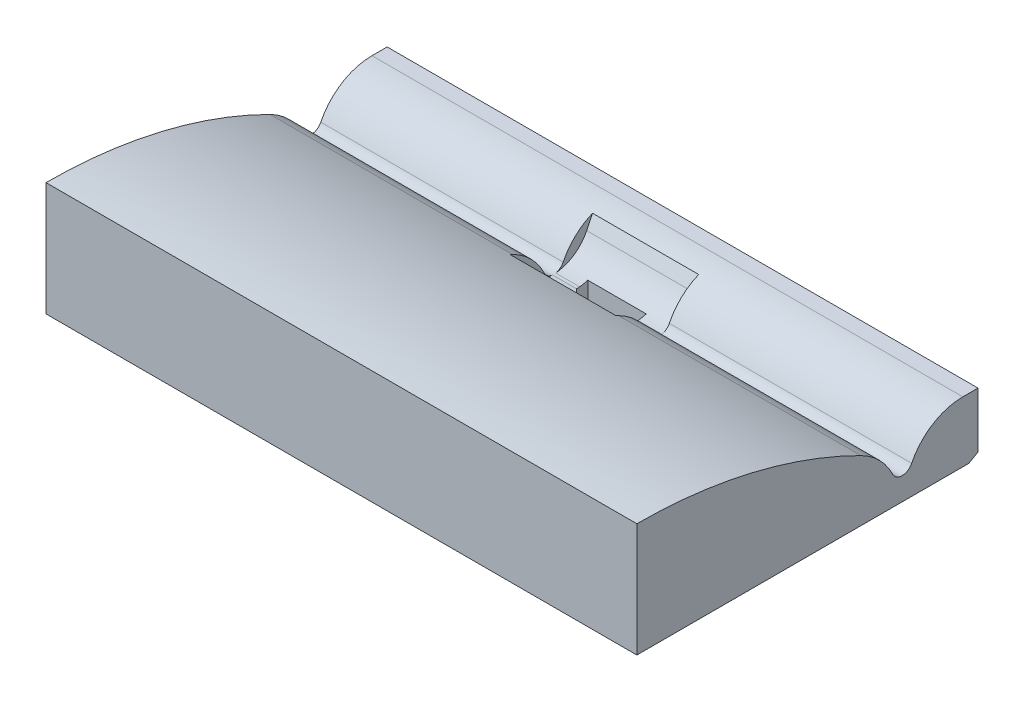
ISO-10303-21;
HEADER;
FILE_DESCRIPTION(('STEP AP214'),'2;1');
FILE_NAME('part.step','',(''),(''),'','','');
FILE_SCHEMA(('AUTOMOTIVE_DESIGN { 1 0 10303 214 1 1 1 1 }'));
ENDSEC;
DATA;
#1=APPLICATION_CONTEXT('core data for automotive mechanical design processes');
#2=APPLICATION_PROTOCOL_DEFINITION('international standard','automotive_design',2000,#1);
#3=PRODUCT_CONTEXT('',#1,'mechanical');
#4=PRODUCT('Part','Part','',(#3));
#5=PRODUCT_RELATED_PRODUCT_CATEGORY('part','',(#4));
#6=PRODUCT_DEFINITION_FORMATION('','',#4);
#7=PRODUCT_DEFINITION_CONTEXT('part definition',#1,'design');
#8=PRODUCT_DEFINITION('design','',#6,#7);
#9=PRODUCT_DEFINITION_SHAPE('','',#8);
#10=(LENGTH_UNIT() NAMED_UNIT(*) SI_UNIT(.MILLI.,.METRE.));
#11=(NAMED_UNIT(*) PLANE_ANGLE_UNIT() SI_UNIT($,.RADIAN.));
#12=(NAMED_UNIT(*) SI_UNIT($,.STERADIAN.) SOLID_ANGLE_UNIT());
#13=UNCERTAINTY_MEASURE_WITH_UNIT(LENGTH_MEASURE(1.E-05),#10,'distance_accuracy_value','');
#14=(GEOMETRIC_REPRESENTATION_CONTEXT(3) GLOBAL_UNCERTAINTY_ASSIGNED_CONTEXT((#13)) GLOBAL_UNIT_ASSIGNED_CONTEXT((#10,
#11,#12)) REPRESENTATION_CONTEXT('',''));
#15=CARTESIAN_POINT('',(0.,0.,0.));
#16=DIRECTION('',(0.,0.,1.));
#17=DIRECTION('',(1.,0.,0.));
#18=AXIS2_PLACEMENT_3D('',#15,#16,#17);
#19=CARTESIAN_POINT('',(38.9711431702997,52.2246829705794,19.5711631372731));
#20=DIRECTION('',(-1.,0.,0.));
#21=DIRECTION('',(0.,0.,1.));
#22=AXIS2_PLACEMENT_3D('',#19,#20,#21);
#23=CYLINDRICAL_SURFACE('',#22,9.25729399021629);
#24=CARTESIAN_POINT('',(7.,52.2246829705794,19.5711631372731));
#25=DIRECTION('',(-1.,0.,0.));
#26=DIRECTION('',(0.,0.,1.));
#27=AXIS2_PLACEMENT_3D('',#24,#25,#26);
#28=CIRCLE('',#27,9.25729399021629);
#29=CARTESIAN_POINT('',(7.,60.5,15.4218716213784));
#30=VERTEX_POINT('',#29);
#31=CARTESIAN_POINT('',(7.,56.28125,11.25));
#32=VERTEX_POINT('',#31);
#33=EDGE_CURVE('E261',#30,#32,#28,.T.);
#34=ORIENTED_EDGE('',*,*,#33,.F.);
#35=DIRECTION('',(-1.,0.,0.));
#36=VECTOR('',#35,1.);
#37=CARTESIAN_POINT('',(38.9711431702997,60.5,15.4218716213784));
#38=LINE('',#37,#36);
#39=CARTESIAN_POINT('',(38.9711431702997,60.5,15.4218716213784));
#40=VERTEX_POINT('',#39);
#41=EDGE_CURVE('E372',#40,#30,#38,.T.);
#42=ORIENTED_EDGE('',*,*,#41,.F.);
#43=CARTESIAN_POINT('',(38.9711431702997,52.2246829705794,19.5711631372731));
#44=DIRECTION('',(1.,0.,0.));
#45=DIRECTION('',(0.,0.,1.));
#46=AXIS2_PLACEMENT_3D('',#43,#44,#45);
#47=CIRCLE('',#46,9.25729399021629);
#48=CARTESIAN_POINT('',(38.9711431702997,56.28125,11.25));
#49=VERTEX_POINT('',#48);
#50=EDGE_CURVE('E353',#49,#40,#47,.T.);
#51=ORIENTED_EDGE('',*,*,#50,.F.);
#52=DIRECTION('',(-1.,0.,0.));
#53=VECTOR('',#52,1.);
#54=CARTESIAN_POINT('',(38.9711431702997,56.28125,11.25));
#55=LINE('',#54,#53);
#56=EDGE_CURVE('E376',#49,#32,#55,.T.);
#57=ORIENTED_EDGE('',*,*,#56,.T.);
#58=EDGE_LOOP('',(#34,#42,#51,#57));
#59=FACE_BOUND('',#58,.T.);
#60=ADVANCED_FACE('F37',(#59),#23,.T.);
#61=CARTESIAN_POINT('',(38.9711431702997,56.890625,10.));
#62=DIRECTION('',(-1.,0.,0.));
#63=DIRECTION('',(0.,0.,1.));
#64=AXIS2_PLACEMENT_3D('',#61,#62,#63);
#65=CYLINDRICAL_SURFACE('',#64,1.390625);
#66=CARTESIAN_POINT('',(7.,56.890625,10.));
#67=DIRECTION('',(-1.,0.,0.));
#68=DIRECTION('',(0.,0.,1.));
#69=AXIS2_PLACEMENT_3D('',#66,#67,#68);
#70=CIRCLE('',#69,1.390625);
#71=CARTESIAN_POINT('',(7.,55.5252776994791,9.73605940140772));
#72=VERTEX_POINT('',#71);
#73=CARTESIAN_POINT('',(7.,56.28125,8.75));
#74=VERTEX_POINT('',#73);
#75=EDGE_CURVE('E266',#72,#74,#70,.F.);
#76=ORIENTED_EDGE('',*,*,#75,.F.);
#77=DIRECTION('',(1.,0.,0.));
#78=VECTOR('',#77,1.);
#79=CARTESIAN_POINT('',(0.,55.5252776994791,9.73605940140772));
#80=LINE('',#79,#78);
#81=CARTESIAN_POINT('',(3.85,55.5252776994791,9.73605940140772));
#82=VERTEX_POINT('',#81);
#83=EDGE_CURVE('E246',#72,#82,#80,.F.);
#84=ORIENTED_EDGE('',*,*,#83,.T.);
#85=CARTESIAN_POINT('',(3.85,56.890625,10.));
#86=DIRECTION('',(1.,0.,0.));
#87=DIRECTION('',(0.,0.,-1.));
#88=AXIS2_PLACEMENT_3D('',#85,#86,#87);
#89=CIRCLE('',#88,1.390625);
#90=CARTESIAN_POINT('',(3.85,55.5081135567833,10.15));
#91=VERTEX_POINT('',#90);
#92=EDGE_CURVE('E290',#91,#82,#89,.T.);
#93=ORIENTED_EDGE('',*,*,#92,.F.);
#94=DIRECTION('',(1.,0.,0.));
#95=VECTOR('',#94,1.);
#96=CARTESIAN_POINT('',(0.,55.5081135567833,10.15));
#97=LINE('',#96,#95);
#98=CARTESIAN_POINT('',(7.,55.5081135567833,10.15));
#99=VERTEX_POINT('',#98);
#100=EDGE_CURVE('E258',#91,#99,#97,.T.);
#101=ORIENTED_EDGE('',*,*,#100,.T.);
#102=EDGE_CURVE('E263',#32,#99,#70,.F.);
#103=ORIENTED_EDGE('',*,*,#102,.F.);
#104=ORIENTED_EDGE('',*,*,#56,.F.);
#105=CARTESIAN_POINT('',(38.9711431702997,56.890625,10.));
#106=DIRECTION('',(-1.,0.,0.));
#107=DIRECTION('',(0.,0.,-1.));
#108=AXIS2_PLACEMENT_3D('',#105,#106,#107);
#109=CIRCLE('',#108,1.390625);
#110=CARTESIAN_POINT('',(38.9711431702997,56.28125,8.75));
#111=VERTEX_POINT('',#110);
#112=EDGE_CURVE('E351',#111,#49,#109,.T.);
#113=ORIENTED_EDGE('',*,*,#112,.F.);
#114=DIRECTION('',(-1.,0.,0.));
#115=VECTOR('',#114,1.);
#116=CARTESIAN_POINT('',(38.9711431702997,56.28125,8.75));
#117=LINE('',#116,#115);
#118=EDGE_CURVE('E380',#111,#74,#117,.T.);
#119=ORIENTED_EDGE('',*,*,#118,.T.);
#120=EDGE_LOOP('',(#76,#84,#93,#101,#103,#104,#113,#119));
#121=FACE_BOUND('',#120,.T.);
#122=ADVANCED_FACE('F456',(#121),#65,.F.);
#123=CARTESIAN_POINT('',(38.9711431702997,53.2,0.));
#124=DIRECTION('',(0.,0.,1.));
#125=DIRECTION('',(1.,0.,0.));
#126=AXIS2_PLACEMENT_3D('',#123,#124,#125);
#127=PLANE('',#126);
#128=DIRECTION('',(-1.,0.,0.));
#129=VECTOR('',#128,1.);
#130=CARTESIAN_POINT('',(38.9711431702997,53.2,0.));
#131=LINE('',#130,#129);
#132=CARTESIAN_POINT('',(38.9711431702997,53.2,0.));
#133=VERTEX_POINT('',#132);
#134=CARTESIAN_POINT('',(-38.9711431702997,53.2,0.));
#135=VERTEX_POINT('',#134);
#136=EDGE_CURVE('E363',#133,#135,#131,.T.);
#137=ORIENTED_EDGE('',*,*,#136,.T.);
#138=DIRECTION('',(0.,1.,0.));
#139=VECTOR('',#138,1.);
#140=CARTESIAN_POINT('',(-38.9711431702997,53.2,0.));
#141=LINE('',#140,#139);
#142=CARTESIAN_POINT('',(-38.9711431702997,60.5,0.));
#143=VERTEX_POINT('',#142);
#144=EDGE_CURVE('E317',#135,#143,#141,.T.);
#145=ORIENTED_EDGE('',*,*,#144,.T.);
#146=DIRECTION('',(-1.,0.,0.));
#147=VECTOR('',#146,1.);
#148=CARTESIAN_POINT('',(38.9711431702997,60.5,0.));
#149=LINE('',#148,#147);
#150=CARTESIAN_POINT('',(38.9711431702997,60.5,0.));
#151=VERTEX_POINT('',#150);
#152=EDGE_CURVE('E385',#151,#143,#149,.T.);
#153=ORIENTED_EDGE('',*,*,#152,.F.);
#154=DIRECTION('',(0.,1.,0.));
#155=VECTOR('',#154,1.);
#156=CARTESIAN_POINT('',(38.9711431702997,53.2,0.));
#157=LINE('',#156,#155);
#158=EDGE_CURVE('E344',#133,#151,#157,.T.);
#159=ORIENTED_EDGE('',*,*,#158,.F.);
#160=EDGE_LOOP('',(#137,#145,#153,#159));
#161=FACE_BOUND('',#160,.T.);
#162=ADVANCED_FACE('F39',(#161),#127,.F.);
#163=CARTESIAN_POINT('',(38.9711431702997,60.5,0.));
#164=DIRECTION('',(0.,-1.,0.));
#165=DIRECTION('',(0.,0.,-1.));
#166=AXIS2_PLACEMENT_3D('',#163,#164,#165);
#167=PLANE('',#166);
#168=ORIENTED_EDGE('',*,*,#152,.T.);
#169=DIRECTION('',(0.,0.,1.));
#170=VECTOR('',#169,1.);
#171=CARTESIAN_POINT('',(-38.9711431702997,60.5,0.));
#172=LINE('',#171,#170);
#173=CARTESIAN_POINT('',(-38.9711431702997,60.5,2.));
#174=VERTEX_POINT('',#173);
#175=EDGE_CURVE('E320',#143,#174,#172,.T.);
#176=ORIENTED_EDGE('',*,*,#175,.T.);
#177=DIRECTION('',(-1.,0.,0.));
#178=VECTOR('',#177,1.);
#179=CARTESIAN_POINT('',(38.9711431702997,60.5,2.));
#180=LINE('',#179,#178);
#181=CARTESIAN_POINT('',(38.9711431702997,60.5,2.));
#182=VERTEX_POINT('',#181);
#183=EDGE_CURVE('E383',#182,#174,#180,.T.);
#184=ORIENTED_EDGE('',*,*,#183,.F.);
#185=DIRECTION('',(0.,0.,1.));
#186=VECTOR('',#185,1.);
#187=CARTESIAN_POINT('',(38.9711431702997,60.5,0.));
#188=LINE('',#187,#186);
#189=EDGE_CURVE('E347',#151,#182,#188,.T.);
#190=ORIENTED_EDGE('',*,*,#189,.F.);
#191=EDGE_LOOP('',(#168,#176,#184,#190));
#192=FACE_BOUND('',#191,.T.);
#193=ADVANCED_FACE('F421',(#192),#167,.F.);
#194=CARTESIAN_POINT('',(38.9711431702997,52.990625,2.));
#195=DIRECTION('',(-1.,0.,0.));
#196=DIRECTION('',(0.,0.,1.));
#197=AXIS2_PLACEMENT_3D('',#194,#195,#196);
#198=CYLINDRICAL_SURFACE('',#197,7.509375);
#199=CARTESIAN_POINT('',(-7.,56.28125,8.75));
#200=VERTEX_POINT('',#199);
#201=CARTESIAN_POINT('',(-38.9711431702997,56.28125,8.75));
#202=VERTEX_POINT('',#201);
#203=EDGE_CURVE('E379',#200,#202,#117,.T.);
#204=ORIENTED_EDGE('',*,*,#203,.F.);
#205=CARTESIAN_POINT('',(-7.,52.990625,2.));
#206=DIRECTION('',(-1.,0.,0.));
#207=DIRECTION('',(0.,0.,1.));
#208=AXIS2_PLACEMENT_3D('',#205,#206,#207);
#209=CIRCLE('',#208,7.509375);
#210=CARTESIAN_POINT('',(-7.,59.9276013910904,4.87559931841684));
#211=VERTEX_POINT('',#210);
#212=EDGE_CURVE('E274',#200,#211,#209,.T.);
#213=ORIENTED_EDGE('',*,*,#212,.T.);
#214=DIRECTION('',(-1.,0.,0.));
#215=VECTOR('',#214,1.);
#216=CARTESIAN_POINT('',(38.9711431702997,59.9276013910904,4.87559931841684));
#217=LINE('',#216,#215);
#218=CARTESIAN_POINT('',(7.,59.9276013910904,4.87559931841684));
#219=VERTEX_POINT('',#218);
#220=EDGE_CURVE('E11',#211,#219,#217,.F.);
#221=ORIENTED_EDGE('',*,*,#220,.T.);
#222=CARTESIAN_POINT('',(7.,52.990625,2.));
#223=DIRECTION('',(-1.,0.,0.));
#224=DIRECTION('',(0.,0.,1.));
#225=AXIS2_PLACEMENT_3D('',#222,#223,#224);
#226=CIRCLE('',#225,7.509375);
#227=EDGE_CURVE('E265',#74,#219,#226,.T.);
#228=ORIENTED_EDGE('',*,*,#227,.F.);
#229=ORIENTED_EDGE('',*,*,#118,.F.);
#230=CARTESIAN_POINT('',(38.9711431702997,52.990625,2.));
#231=DIRECTION('',(1.,0.,0.));
#232=DIRECTION('',(0.,0.,1.));
#233=AXIS2_PLACEMENT_3D('',#230,#231,#232);
#234=CIRCLE('',#233,7.509375);
#235=EDGE_CURVE('E349',#182,#111,#234,.T.);
#236=ORIENTED_EDGE('',*,*,#235,.F.);
#237=ORIENTED_EDGE('',*,*,#183,.T.);
#238=CARTESIAN_POINT('',(-38.9711431702997,52.990625,2.));
#239=DIRECTION('',(1.,0.,0.));
#240=DIRECTION('',(0.,0.,1.));
#241=AXIS2_PLACEMENT_3D('',#238,#239,#240);
#242=CIRCLE('',#241,7.509375);
#243=EDGE_CURVE('E323',#174,#202,#242,.T.);
#244=ORIENTED_EDGE('',*,*,#243,.T.);
#245=EDGE_LOOP('',(#204,#213,#221,#228,#229,#236,#237,#244));
#246=FACE_BOUND('',#245,.T.);
#247=ADVANCED_FACE('F416',(#246),#198,.T.);
#248=CARTESIAN_POINT('',(-3.85,56.890625,10.));
#249=DIRECTION('',(-1.,0.,0.));
#250=DIRECTION('',(0.,0.,1.));
#251=AXIS2_PLACEMENT_3D('',#248,#249,#250);
#252=CIRCLE('',#251,1.390625);
#253=CARTESIAN_POINT('',(-3.85,55.5252776994791,9.73605940140772));
#254=VERTEX_POINT('',#253);
#255=CARTESIAN_POINT('',(-3.85,55.5081135567833,10.15));
#256=VERTEX_POINT('',#255);
#257=EDGE_CURVE('E314',#254,#256,#252,.T.);
#258=ORIENTED_EDGE('',*,*,#257,.F.);
#259=DIRECTION('',(1.,0.,0.));
#260=VECTOR('',#259,1.);
#261=CARTESIAN_POINT('',(0.,55.5252776994791,9.73605940140772));
#262=LINE('',#261,#260);
#263=CARTESIAN_POINT('',(-7.,55.5252776994791,9.73605940140772));
#264=VERTEX_POINT('',#263);
#265=EDGE_CURVE('E244',#254,#264,#262,.F.);
#266=ORIENTED_EDGE('',*,*,#265,.T.);
#267=CARTESIAN_POINT('',(-7.,56.890625,10.));
#268=DIRECTION('',(-1.,0.,0.));
#269=DIRECTION('',(0.,0.,1.));
#270=AXIS2_PLACEMENT_3D('',#267,#268,#269);
#271=CIRCLE('',#270,1.390625);
#272=EDGE_CURVE('E211',#264,#200,#271,.F.);
#273=ORIENTED_EDGE('',*,*,#272,.T.);
#274=ORIENTED_EDGE('',*,*,#203,.T.);
#275=CARTESIAN_POINT('',(-38.9711431702997,56.890625,10.));
#276=DIRECTION('',(-1.,0.,0.));
#277=DIRECTION('',(0.,0.,-1.));
#278=AXIS2_PLACEMENT_3D('',#275,#276,#277);
#279=CIRCLE('',#278,1.390625);
#280=CARTESIAN_POINT('',(-38.9711431702997,56.28125,11.25));
#281=VERTEX_POINT('',#280);
#282=EDGE_CURVE('E326',#202,#281,#279,.T.);
#283=ORIENTED_EDGE('',*,*,#282,.T.);
#284=CARTESIAN_POINT('',(-7.,56.28125,11.25));
#285=VERTEX_POINT('',#284);
#286=EDGE_CURVE('E375',#285,#281,#55,.T.);
#287=ORIENTED_EDGE('',*,*,#286,.F.);
#288=CARTESIAN_POINT('',(-7.,55.5081135567833,10.15));
#289=VERTEX_POINT('',#288);
#290=EDGE_CURVE('E271',#285,#289,#271,.F.);
#291=ORIENTED_EDGE('',*,*,#290,.T.);
#292=DIRECTION('',(1.,0.,0.));
#293=VECTOR('',#292,1.);
#294=CARTESIAN_POINT('',(0.,55.5081135567833,10.15));
#295=LINE('',#294,#293);
#296=EDGE_CURVE('E255',#289,#256,#295,.T.);
#297=ORIENTED_EDGE('',*,*,#296,.T.);
#298=EDGE_LOOP('',(#258,#266,#273,#274,#283,#287,#291,#297));
#299=FACE_BOUND('',#298,.T.);
#300=ADVANCED_FACE('F413',(#299),#65,.F.);
#301=CARTESIAN_POINT('',(-7.,60.5,15.4218716213784));
#302=VERTEX_POINT('',#301);
#303=CARTESIAN_POINT('',(-38.9711431702997,60.5,15.4218716213784));
#304=VERTEX_POINT('',#303);
#305=EDGE_CURVE('E371',#302,#304,#38,.T.);
#306=ORIENTED_EDGE('',*,*,#305,.F.);
#307=CARTESIAN_POINT('',(-7.,52.2246829705794,19.5711631372731));
#308=DIRECTION('',(-1.,0.,0.));
#309=DIRECTION('',(0.,0.,1.));
#310=AXIS2_PLACEMENT_3D('',#307,#308,#309);
#311=CIRCLE('',#310,9.25729399021629);
#312=EDGE_CURVE('E268',#302,#285,#311,.T.);
#313=ORIENTED_EDGE('',*,*,#312,.T.);
#314=ORIENTED_EDGE('',*,*,#286,.T.);
#315=CARTESIAN_POINT('',(-38.9711431702997,52.2246829705794,19.5711631372731));
#316=DIRECTION('',(1.,0.,0.));
#317=DIRECTION('',(0.,0.,1.));
#318=AXIS2_PLACEMENT_3D('',#315,#316,#317);
#319=CIRCLE('',#318,9.25729399021629);
#320=EDGE_CURVE('E329',#281,#304,#319,.T.);
#321=ORIENTED_EDGE('',*,*,#320,.T.);
#322=EDGE_LOOP('',(#306,#313,#314,#321));
#323=FACE_BOUND('',#322,.T.);
#324=ADVANCED_FACE('F402',(#323),#23,.T.);
#325=CARTESIAN_POINT('',(38.9711431702997,1.50959440127008,45.));
#326=DIRECTION('',(-1.,0.,0.));
#327=DIRECTION('',(0.,0.,1.));
#328=AXIS2_PLACEMENT_3D('',#325,#326,#327);
#329=CYLINDRICAL_SURFACE('',#328,65.99040559873);
#330=DIRECTION('',(-1.,0.,0.));
#331=VECTOR('',#330,1.);
#332=CARTESIAN_POINT('',(38.9711431702997,60.683362123709,15.7904323103588));
#333=LINE('',#332,#331);
#334=CARTESIAN_POINT('',(7.,60.6833621237091,15.7904323103588));
#335=VERTEX_POINT('',#334);
#336=CARTESIAN_POINT('',(-7.,60.6833621237091,15.7904323103588));
#337=VERTEX_POINT('',#336);
#338=EDGE_CURVE('E391',#335,#337,#333,.T.);
#339=ORIENTED_EDGE('',*,*,#338,.T.);
#340=CARTESIAN_POINT('',(-7.,1.50959440127008,45.));
#341=DIRECTION('',(-1.,0.,0.));
#342=DIRECTION('',(0.,0.,1.));
#343=AXIS2_PLACEMENT_3D('',#340,#341,#342);
#344=CIRCLE('',#343,65.99040559873);
#345=EDGE_CURVE('E45',#337,#302,#344,.T.);
#346=ORIENTED_EDGE('',*,*,#345,.T.);
#347=ORIENTED_EDGE('',*,*,#305,.T.);
#348=CARTESIAN_POINT('',(-38.9711431702997,1.50959440127008,45.));
#349=DIRECTION('',(1.,0.,0.));
#350=DIRECTION('',(0.,0.,-1.));
#351=AXIS2_PLACEMENT_3D('',#348,#349,#350);
#352=CIRCLE('',#351,65.99040559873);
#353=CARTESIAN_POINT('',(-38.9711431702997,67.5,45.));
#354=VERTEX_POINT('',#353);
#355=EDGE_CURVE('E332',#304,#354,#352,.T.);
#356=ORIENTED_EDGE('',*,*,#355,.T.);
#357=DIRECTION('',(-1.,0.,0.));
#358=VECTOR('',#357,1.);
#359=CARTESIAN_POINT('',(38.9711431702997,67.5,45.));
#360=LINE('',#359,#358);
#361=CARTESIAN_POINT('',(38.9711431702997,67.5,45.));
#362=VERTEX_POINT('',#361);
#363=EDGE_CURVE('E369',#362,#354,#360,.T.);
#364=ORIENTED_EDGE('',*,*,#363,.F.);
#365=CARTESIAN_POINT('',(38.9711431702997,1.50959440127008,45.));
#366=DIRECTION('',(1.,0.,0.));
#367=DIRECTION('',(0.,0.,-1.));
#368=AXIS2_PLACEMENT_3D('',#365,#366,#367);
#369=CIRCLE('',#368,65.99040559873);
#370=EDGE_CURVE('E355',#40,#362,#369,.T.);
#371=ORIENTED_EDGE('',*,*,#370,.F.);
#372=ORIENTED_EDGE('',*,*,#41,.T.);
#373=CARTESIAN_POINT('',(7.,1.50959440127008,45.));
#374=DIRECTION('',(-1.,0.,0.));
#375=DIRECTION('',(0.,0.,1.));
#376=AXIS2_PLACEMENT_3D('',#373,#374,#375);
#377=CIRCLE('',#376,65.99040559873);
#378=EDGE_CURVE('E389',#335,#30,#377,.T.);
#379=ORIENTED_EDGE('',*,*,#378,.F.);
#380=EDGE_LOOP('',(#339,#346,#347,#356,#364,#371,#372,#379));
#381=FACE_BOUND('',#380,.T.);
#382=ADVANCED_FACE('F396',(#381),#329,.T.);
#383=CARTESIAN_POINT('',(38.9711431702997,67.5,45.));
#384=DIRECTION('',(0.,0.,-1.));
#385=DIRECTION('',(-1.,0.,0.));
#386=AXIS2_PLACEMENT_3D('',#383,#384,#385);
#387=PLANE('',#386);
#388=ORIENTED_EDGE('',*,*,#363,.T.);
#389=DIRECTION('',(0.,-1.,0.));
#390=VECTOR('',#389,1.);
#391=CARTESIAN_POINT('',(-38.9711431702997,67.5,45.));
#392=LINE('',#391,#390);
#393=CARTESIAN_POINT('',(-38.9711431702997,52.5,45.));
#394=VERTEX_POINT('',#393);
#395=EDGE_CURVE('E335',#354,#394,#392,.T.);
#396=ORIENTED_EDGE('',*,*,#395,.T.);
#397=DIRECTION('',(-1.,0.,0.));
#398=VECTOR('',#397,1.);
#399=CARTESIAN_POINT('',(38.9711431702997,52.5,45.));
#400=LINE('',#399,#398);
#401=CARTESIAN_POINT('',(38.9711431702997,52.5,45.));
#402=VERTEX_POINT('',#401);
#403=EDGE_CURVE('E367',#402,#394,#400,.T.);
#404=ORIENTED_EDGE('',*,*,#403,.F.);
#405=DIRECTION('',(0.,-1.,0.));
#406=VECTOR('',#405,1.);
#407=CARTESIAN_POINT('',(38.9711431702997,67.5,45.));
#408=LINE('',#407,#406);
#409=EDGE_CURVE('E357',#362,#402,#408,.T.);
#410=ORIENTED_EDGE('',*,*,#409,.F.);
#411=EDGE_LOOP('',(#388,#396,#404,#410));
#412=FACE_BOUND('',#411,.T.);
#413=ADVANCED_FACE('F437',(#412),#387,.F.);
#414=CARTESIAN_POINT('',(38.9711431702997,52.5,1.2124355652982));
#415=DIRECTION('',(0.,1.,0.));
#416=DIRECTION('',(0.,0.,1.));
#417=AXIS2_PLACEMENT_3D('',#414,#415,#416);
#418=PLANE('',#417);
#419=DIRECTION('',(-0.707106781186547,0.,0.707106781186548));
#420=VECTOR('',#419,1.);
#421=CARTESIAN_POINT('',(3.85,52.5,10.15));
#422=LINE('',#421,#420);
#423=CARTESIAN_POINT('',(3.85,52.5,10.15));
#424=VERTEX_POINT('',#423);
#425=CARTESIAN_POINT('',(2.65,52.5,11.35));
#426=VERTEX_POINT('',#425);
#427=EDGE_CURVE('E284',#424,#426,#422,.T.);
#428=ORIENTED_EDGE('',*,*,#427,.F.);
#429=DIRECTION('',(0.,0.,1.));
#430=VECTOR('',#429,1.);
#431=CARTESIAN_POINT('',(3.85,52.5,8.65));
#432=LINE('',#431,#430);
#433=CARTESIAN_POINT('',(3.85,52.5,8.65));
#434=VERTEX_POINT('',#433);
#435=EDGE_CURVE('E287',#434,#424,#432,.T.);
#436=ORIENTED_EDGE('',*,*,#435,.F.);
#437=DIRECTION('',(1.,0.,0.));
#438=VECTOR('',#437,1.);
#439=CARTESIAN_POINT('',(3.85,52.5,8.65));
#440=LINE('',#439,#438);
#441=CARTESIAN_POINT('',(-3.85,52.5,8.65));
#442=VERTEX_POINT('',#441);
#443=EDGE_CURVE('E297',#442,#434,#440,.T.);
#444=ORIENTED_EDGE('',*,*,#443,.F.);
#445=DIRECTION('',(0.,0.,-1.));
#446=VECTOR('',#445,1.);
#447=CARTESIAN_POINT('',(-3.85,52.5,8.65));
#448=LINE('',#447,#446);
#449=CARTESIAN_POINT('',(-3.85,52.5,10.15));
#450=VERTEX_POINT('',#449);
#451=EDGE_CURVE('E276',#450,#442,#448,.T.);
#452=ORIENTED_EDGE('',*,*,#451,.F.);
#453=DIRECTION('',(-0.707106781186547,0.,-0.707106781186548));
#454=VECTOR('',#453,1.);
#455=CARTESIAN_POINT('',(-2.65,52.5,11.35));
#456=LINE('',#455,#454);
#457=CARTESIAN_POINT('',(-2.65,52.5,11.35));
#458=VERTEX_POINT('',#457);
#459=EDGE_CURVE('E278',#458,#450,#456,.T.);
#460=ORIENTED_EDGE('',*,*,#459,.F.);
#461=DIRECTION('',(-1.,0.,0.));
#462=VECTOR('',#461,1.);
#463=CARTESIAN_POINT('',(2.65,52.5,11.35));
#464=LINE('',#463,#462);
#465=EDGE_CURVE('E281',#426,#458,#464,.T.);
#466=ORIENTED_EDGE('',*,*,#465,.F.);
#467=EDGE_LOOP('',(#428,#436,#444,#452,#460,#466));
#468=FACE_BOUND('',#467,.T.);
#469=ORIENTED_EDGE('',*,*,#403,.T.);
#470=DIRECTION('',(0.,0.,-1.));
#471=VECTOR('',#470,1.);
#472=CARTESIAN_POINT('',(-38.9711431702997,52.5,1.2124355652982));
#473=LINE('',#472,#471);
#474=CARTESIAN_POINT('',(-38.9711431702997,52.5,1.2124355652982));
#475=VERTEX_POINT('',#474);
#476=EDGE_CURVE('E338',#394,#475,#473,.T.);
#477=ORIENTED_EDGE('',*,*,#476,.T.);
#478=DIRECTION('',(-1.,0.,0.));
#479=VECTOR('',#478,1.);
#480=CARTESIAN_POINT('',(38.9711431702997,52.5,1.2124355652982));
#481=LINE('',#480,#479);
#482=CARTESIAN_POINT('',(38.9711431702997,52.5,1.2124355652982));
#483=VERTEX_POINT('',#482);
#484=EDGE_CURVE('E365',#483,#475,#481,.T.);
#485=ORIENTED_EDGE('',*,*,#484,.F.);
#486=DIRECTION('',(0.,0.,-1.));
#487=VECTOR('',#486,1.);
#488=CARTESIAN_POINT('',(38.9711431702997,52.5,1.2124355652982));
#489=LINE('',#488,#487);
#490=EDGE_CURVE('E359',#402,#483,#489,.T.);
#491=ORIENTED_EDGE('',*,*,#490,.F.);
#492=EDGE_LOOP('',(#469,#477,#485,#491));
#493=FACE_BOUND('',#492,.T.);
#494=ADVANCED_FACE('F434',(#468,#493),#418,.F.);
#495=CARTESIAN_POINT('',(38.9711431702997,53.2,0.));
#496=DIRECTION('',(0.,0.866025403784436,0.500000000000004));
#497=DIRECTION('',(0.,-0.500000000000004,0.866025403784436));
#498=AXIS2_PLACEMENT_3D('',#495,#496,#497);
#499=PLANE('',#498);
#500=ORIENTED_EDGE('',*,*,#484,.T.);
#501=DIRECTION('',(0.,0.500000000000004,-0.866025403784436));
#502=VECTOR('',#501,1.);
#503=CARTESIAN_POINT('',(-38.9711431702997,53.2,0.));
#504=LINE('',#503,#502);
#505=EDGE_CURVE('E341',#475,#135,#504,.T.);
#506=ORIENTED_EDGE('',*,*,#505,.T.);
#507=ORIENTED_EDGE('',*,*,#136,.F.);
#508=DIRECTION('',(0.,0.500000000000004,-0.866025403784436));
#509=VECTOR('',#508,1.);
#510=CARTESIAN_POINT('',(38.9711431702997,53.2,0.));
#511=LINE('',#510,#509);
#512=EDGE_CURVE('E361',#483,#133,#511,.T.);
#513=ORIENTED_EDGE('',*,*,#512,.F.);
#514=EDGE_LOOP('',(#500,#506,#507,#513));
#515=FACE_BOUND('',#514,.T.);
#516=ADVANCED_FACE('F429',(#515),#499,.F.);
#517=CARTESIAN_POINT('',(38.9711431702997,52.990625,2.));
#518=DIRECTION('',(-1.,0.,0.));
#519=DIRECTION('',(0.,0.,1.));
#520=AXIS2_PLACEMENT_3D('',#517,#518,#519);
#521=PLANE('',#520);
#522=ORIENTED_EDGE('',*,*,#158,.T.);
#523=ORIENTED_EDGE('',*,*,#189,.T.);
#524=ORIENTED_EDGE('',*,*,#235,.T.);
#525=ORIENTED_EDGE('',*,*,#112,.T.);
#526=ORIENTED_EDGE('',*,*,#50,.T.);
#527=ORIENTED_EDGE('',*,*,#370,.T.);
#528=ORIENTED_EDGE('',*,*,#409,.T.);
#529=ORIENTED_EDGE('',*,*,#490,.T.);
#530=ORIENTED_EDGE('',*,*,#512,.T.);
#531=EDGE_LOOP('',(#522,#523,#524,#525,#526,#527,#528,#529,#530));
#532=FACE_BOUND('',#531,.T.);
#533=ADVANCED_FACE('F443',(#532),#521,.F.);
#534=CARTESIAN_POINT('',(-38.9711431702997,52.990625,2.));
#535=DIRECTION('',(-1.,0.,0.));
#536=DIRECTION('',(0.,0.,1.));
#537=AXIS2_PLACEMENT_3D('',#534,#535,#536);
#538=PLANE('',#537);
#539=ORIENTED_EDGE('',*,*,#144,.F.);
#540=ORIENTED_EDGE('',*,*,#505,.F.);
#541=ORIENTED_EDGE('',*,*,#476,.F.);
#542=ORIENTED_EDGE('',*,*,#395,.F.);
#543=ORIENTED_EDGE('',*,*,#355,.F.);
#544=ORIENTED_EDGE('',*,*,#320,.F.);
#545=ORIENTED_EDGE('',*,*,#282,.F.);
#546=ORIENTED_EDGE('',*,*,#243,.F.);
#547=ORIENTED_EDGE('',*,*,#175,.F.);
#548=EDGE_LOOP('',(#539,#540,#541,#542,#543,#544,#545,#546,#547));
#549=FACE_BOUND('',#548,.T.);
#550=ADVANCED_FACE('F408',(#549),#538,.T.);
#551=CARTESIAN_POINT('',(3.85,52.499,8.65));
#552=DIRECTION('',(1.,0.,0.));
#553=DIRECTION('',(0.,0.,-1.));
#554=AXIS2_PLACEMENT_3D('',#551,#552,#553);
#555=PLANE('',#554);
#556=ORIENTED_EDGE('',*,*,#92,.T.);
#557=CARTESIAN_POINT('',(3.85,60.5081135567833,10.15));
#558=DIRECTION('',(1.,0.,0.));
#559=DIRECTION('',(0.,0.,-1.));
#560=AXIS2_PLACEMENT_3D('',#557,#558,#559);
#561=CIRCLE('',#560,5.);
#562=CARTESIAN_POINT('',(3.85,55.7384175496986,8.65));
#563=VERTEX_POINT('',#562);
#564=EDGE_CURVE('E241',#82,#563,#561,.T.);
#565=ORIENTED_EDGE('',*,*,#564,.T.);
#566=DIRECTION('',(0.,1.,0.));
#567=VECTOR('',#566,1.);
#568=CARTESIAN_POINT('',(3.85,52.499,8.65));
#569=LINE('',#568,#567);
#570=EDGE_CURVE('E293',#434,#563,#569,.T.);
#571=ORIENTED_EDGE('',*,*,#570,.F.);
#572=ORIENTED_EDGE('',*,*,#435,.T.);
#573=DIRECTION('',(0.,1.,0.));
#574=VECTOR('',#573,1.);
#575=CARTESIAN_POINT('',(3.85,52.499,10.15));
#576=LINE('',#575,#574);
#577=EDGE_CURVE('E294',#424,#91,#576,.T.);
#578=ORIENTED_EDGE('',*,*,#577,.T.);
#579=EDGE_LOOP('',(#556,#565,#571,#572,#578));
#580=FACE_BOUND('',#579,.T.);
#581=ADVANCED_FACE('F462',(#580),#555,.F.);
#582=CARTESIAN_POINT('',(3.85,52.499,10.15));
#583=DIRECTION('',(0.707106781186548,0.,0.707106781186547));
#584=DIRECTION('',(0.707106781186547,0.,-0.707106781186548));
#585=AXIS2_PLACEMENT_3D('',#582,#583,#584);
#586=PLANE('',#585);
#587=DIRECTION('',(0.,1.,0.));
#588=VECTOR('',#587,1.);
#589=CARTESIAN_POINT('',(2.65,52.499,11.35));
#590=LINE('',#589,#588);
#591=CARTESIAN_POINT('',(2.65,55.6542491169787,11.35));
#592=VERTEX_POINT('',#591);
#593=EDGE_CURVE('E298',#426,#592,#590,.T.);
#594=ORIENTED_EDGE('',*,*,#593,.T.);
#595=CARTESIAN_POINT('',(3.84999999999999,60.5081135567833,10.15));
#596=DIRECTION('',(0.707106781186548,0.,0.707106781186547));
#597=DIRECTION('',(0.707106781186547,0.,-0.707106781186548));
#598=AXIS2_PLACEMENT_3D('',#595,#596,#597);
#599=ELLIPSE('',#598,7.07106781186547,5.);
#600=EDGE_CURVE('E252',#592,#91,#599,.T.);
#601=ORIENTED_EDGE('',*,*,#600,.T.);
#602=ORIENTED_EDGE('',*,*,#577,.F.);
#603=ORIENTED_EDGE('',*,*,#427,.T.);
#604=EDGE_LOOP('',(#594,#601,#602,#603));
#605=FACE_BOUND('',#604,.T.);
#606=ADVANCED_FACE('F460',(#605),#586,.F.);
#607=CARTESIAN_POINT('',(2.65,52.499,11.35));
#608=DIRECTION('',(0.,0.,1.));
#609=DIRECTION('',(1.,0.,0.));
#610=AXIS2_PLACEMENT_3D('',#607,#608,#609);
#611=PLANE('',#610);
#612=DIRECTION('',(0.,1.,0.));
#613=VECTOR('',#612,1.);
#614=CARTESIAN_POINT('',(-2.65,52.499,11.35));
#615=LINE('',#614,#613);
#616=CARTESIAN_POINT('',(-2.65,55.6542491169787,11.35));
#617=VERTEX_POINT('',#616);
#618=EDGE_CURVE('E301',#458,#617,#615,.T.);
#619=ORIENTED_EDGE('',*,*,#618,.T.);
#620=DIRECTION('',(1.,0.,0.));
#621=VECTOR('',#620,1.);
#622=CARTESIAN_POINT('',(-7.,55.6542491169787,11.35));
#623=LINE('',#622,#621);
#624=EDGE_CURVE('E52',#617,#592,#623,.T.);
#625=ORIENTED_EDGE('',*,*,#624,.T.);
#626=ORIENTED_EDGE('',*,*,#593,.F.);
#627=ORIENTED_EDGE('',*,*,#465,.T.);
#628=EDGE_LOOP('',(#619,#625,#626,#627));
#629=FACE_BOUND('',#628,.T.);
#630=ADVANCED_FACE('F471',(#629),#611,.F.);
#631=CARTESIAN_POINT('',(-2.65,52.499,11.35));
#632=DIRECTION('',(-0.707106781186548,0.,0.707106781186547));
#633=DIRECTION('',(0.707106781186547,0.,0.707106781186548));
#634=AXIS2_PLACEMENT_3D('',#631,#632,#633);
#635=PLANE('',#634);
#636=DIRECTION('',(0.,1.,0.));
#637=VECTOR('',#636,1.);
#638=CARTESIAN_POINT('',(-3.85,52.499,10.15));
#639=LINE('',#638,#637);
#640=EDGE_CURVE('E304',#450,#256,#639,.T.);
#641=ORIENTED_EDGE('',*,*,#640,.T.);
#642=CARTESIAN_POINT('',(-3.84999999999999,60.5081135567833,10.15));
#643=DIRECTION('',(-0.707106781186548,0.,0.707106781186547));
#644=DIRECTION('',(0.707106781186547,0.,0.707106781186548));
#645=AXIS2_PLACEMENT_3D('',#642,#643,#644);
#646=ELLIPSE('',#645,7.07106781186547,5.);
#647=EDGE_CURVE('E249',#256,#617,#646,.T.);
#648=ORIENTED_EDGE('',*,*,#647,.T.);
#649=ORIENTED_EDGE('',*,*,#618,.F.);
#650=ORIENTED_EDGE('',*,*,#459,.T.);
#651=EDGE_LOOP('',(#641,#648,#649,#650));
#652=FACE_BOUND('',#651,.T.);
#653=ADVANCED_FACE('F473',(#652),#635,.F.);
#654=CARTESIAN_POINT('',(-3.85,52.499,8.65));
#655=DIRECTION('',(-1.,0.,0.));
#656=DIRECTION('',(0.,0.,1.));
#657=AXIS2_PLACEMENT_3D('',#654,#655,#656);
#658=PLANE('',#657);
#659=DIRECTION('',(0.,1.,0.));
#660=VECTOR('',#659,1.);
#661=CARTESIAN_POINT('',(-3.85,52.499,8.65));
#662=LINE('',#661,#660);
#663=CARTESIAN_POINT('',(-3.85,55.7384175496986,8.65));
#664=VERTEX_POINT('',#663);
#665=EDGE_CURVE('E307',#442,#664,#662,.T.);
#666=ORIENTED_EDGE('',*,*,#665,.T.);
#667=CARTESIAN_POINT('',(-3.85,60.5081135567833,10.15));
#668=DIRECTION('',(-1.,0.,0.));
#669=DIRECTION('',(0.,0.,1.));
#670=AXIS2_PLACEMENT_3D('',#667,#668,#669);
#671=CIRCLE('',#670,5.);
#672=EDGE_CURVE('E60',#664,#254,#671,.T.);
#673=ORIENTED_EDGE('',*,*,#672,.T.);
#674=ORIENTED_EDGE('',*,*,#257,.T.);
#675=ORIENTED_EDGE('',*,*,#640,.F.);
#676=ORIENTED_EDGE('',*,*,#451,.T.);
#677=EDGE_LOOP('',(#666,#673,#674,#675,#676));
#678=FACE_BOUND('',#677,.T.);
#679=ADVANCED_FACE('F476',(#678),#658,.F.);
#680=CARTESIAN_POINT('',(3.85,52.499,8.65));
#681=DIRECTION('',(0.,0.,-1.));
#682=DIRECTION('',(-1.,0.,0.));
#683=AXIS2_PLACEMENT_3D('',#680,#681,#682);
#684=PLANE('',#683);
#685=ORIENTED_EDGE('',*,*,#570,.T.);
#686=DIRECTION('',(1.,0.,0.));
#687=VECTOR('',#686,1.);
#688=CARTESIAN_POINT('',(-7.,55.7384175496986,8.65));
#689=LINE('',#688,#687);
#690=EDGE_CURVE('E387',#563,#664,#689,.F.);
#691=ORIENTED_EDGE('',*,*,#690,.T.);
#692=ORIENTED_EDGE('',*,*,#665,.F.);
#693=ORIENTED_EDGE('',*,*,#443,.T.);
#694=EDGE_LOOP('',(#685,#691,#692,#693));
#695=FACE_BOUND('',#694,.T.);
#696=ADVANCED_FACE('F479',(#695),#684,.F.);
#697=CARTESIAN_POINT('',(-7.,60.5081135567833,10.15));
#698=DIRECTION('',(1.,0.,0.));
#699=DIRECTION('',(0.,0.,-1.));
#700=AXIS2_PLACEMENT_3D('',#697,#698,#699);
#701=CYLINDRICAL_SURFACE('',#700,5.);
#702=CARTESIAN_POINT('',(7.,60.5081135567833,10.15));
#703=DIRECTION('',(1.,0.,0.));
#704=DIRECTION('',(0.,0.,1.));
#705=AXIS2_PLACEMENT_3D('',#702,#703,#704);
#706=CIRCLE('',#705,5.);
#707=CARTESIAN_POINT('',(7.,58.328664085013,5.65000000000001));
#708=VERTEX_POINT('',#707);
#709=EDGE_CURVE('E220',#72,#708,#706,.T.);
#710=ORIENTED_EDGE('',*,*,#709,.T.);
#711=DIRECTION('',(1.,0.,0.));
#712=VECTOR('',#711,1.);
#713=CARTESIAN_POINT('',(-7.,58.328664085013,5.65000000000001));
#714=LINE('',#713,#712);
#715=CARTESIAN_POINT('',(-7.,58.328664085013,5.65000000000001));
#716=VERTEX_POINT('',#715);
#717=EDGE_CURVE('E217',#716,#708,#714,.T.);
#718=ORIENTED_EDGE('',*,*,#717,.F.);
#719=CARTESIAN_POINT('',(-7.,60.5081135567833,10.15));
#720=DIRECTION('',(1.,0.,0.));
#721=DIRECTION('',(0.,0.,1.));
#722=AXIS2_PLACEMENT_3D('',#719,#720,#721);
#723=CIRCLE('',#722,5.);
#724=EDGE_CURVE('E204',#264,#716,#723,.T.);
#725=ORIENTED_EDGE('',*,*,#724,.F.);
#726=ORIENTED_EDGE('',*,*,#265,.F.);
#727=ORIENTED_EDGE('',*,*,#672,.F.);
#728=ORIENTED_EDGE('',*,*,#690,.F.);
#729=ORIENTED_EDGE('',*,*,#564,.F.);
#730=ORIENTED_EDGE('',*,*,#83,.F.);
#731=EDGE_LOOP('',(#710,#718,#725,#726,#727,#728,#729,#730));
#732=FACE_BOUND('',#731,.T.);
#733=ADVANCED_FACE('F218',(#732),#701,.F.);
#734=CARTESIAN_POINT('',(-7.,60.5081135567833,10.15));
#735=DIRECTION('',(-1.,0.,0.));
#736=DIRECTION('',(0.,0.,1.));
#737=AXIS2_PLACEMENT_3D('',#734,#735,#736);
#738=PLANE('',#737);
#739=ORIENTED_EDGE('',*,*,#272,.F.);
#740=ORIENTED_EDGE('',*,*,#724,.T.);
#741=DIRECTION('',(0.,0.900000000000001,-0.435889894354065));
#742=VECTOR('',#741,1.);
#743=CARTESIAN_POINT('',(-7.,58.328664085013,5.65000000000001));
#744=LINE('',#743,#742);
#745=EDGE_CURVE('E208',#716,#211,#744,.T.);
#746=ORIENTED_EDGE('',*,*,#745,.T.);
#747=ORIENTED_EDGE('',*,*,#212,.F.);
#748=EDGE_LOOP('',(#739,#740,#746,#747));
#749=FACE_BOUND('',#748,.T.);
#750=ADVANCED_FACE('F206',(#749),#738,.F.);
#751=CARTESIAN_POINT('',(7.,60.5081135567833,10.15));
#752=DIRECTION('',(-1.,0.,0.));
#753=DIRECTION('',(0.,0.,1.));
#754=AXIS2_PLACEMENT_3D('',#751,#752,#753);
#755=PLANE('',#754);
#756=ORIENTED_EDGE('',*,*,#75,.T.);
#757=ORIENTED_EDGE('',*,*,#227,.T.);
#758=DIRECTION('',(0.,0.900000000000001,-0.435889894354065));
#759=VECTOR('',#758,1.);
#760=CARTESIAN_POINT('',(7.,58.328664085013,5.65000000000001));
#761=LINE('',#760,#759);
#762=EDGE_CURVE('E235',#708,#219,#761,.T.);
#763=ORIENTED_EDGE('',*,*,#762,.F.);
#764=ORIENTED_EDGE('',*,*,#709,.F.);
#765=EDGE_LOOP('',(#756,#757,#763,#764));
#766=FACE_BOUND('',#765,.T.);
#767=ADVANCED_FACE('F483',(#766),#755,.T.);
#768=CARTESIAN_POINT('',(-7.,58.328664085013,5.65000000000001));
#769=DIRECTION('',(0.,-0.435889894354065,-0.900000000000001));
#770=DIRECTION('',(0.,0.900000000000001,-0.435889894354065));
#771=AXIS2_PLACEMENT_3D('',#768,#769,#770);
#772=PLANE('',#771);
#773=ORIENTED_EDGE('',*,*,#745,.F.);
#774=ORIENTED_EDGE('',*,*,#717,.T.);
#775=ORIENTED_EDGE('',*,*,#762,.T.);
#776=ORIENTED_EDGE('',*,*,#220,.F.);
#777=EDGE_LOOP('',(#773,#774,#775,#776));
#778=FACE_BOUND('',#777,.T.);
#779=ADVANCED_FACE('F227',(#778),#772,.F.);
#780=CARTESIAN_POINT('',(-7.,67.2788754134398,18.9847851893273));
#781=DIRECTION('',(0.,-0.435889894354068,0.9));
#782=DIRECTION('',(0.,-0.9,-0.435889894354068));
#783=AXIS2_PLACEMENT_3D('',#780,#781,#782);
#784=PLANE('',#783);
#785=DIRECTION('',(0.,-0.9,-0.435889894354068));
#786=VECTOR('',#785,1.);
#787=CARTESIAN_POINT('',(7.,67.2788754134398,18.9847851893273));
#788=LINE('',#787,#786);
#789=CARTESIAN_POINT('',(7.,58.328664085013,14.65));
#790=VERTEX_POINT('',#789);
#791=EDGE_CURVE('E214',#335,#790,#788,.T.);
#792=ORIENTED_EDGE('',*,*,#791,.T.);
#793=DIRECTION('',(1.,0.,0.));
#794=VECTOR('',#793,1.);
#795=CARTESIAN_POINT('',(-7.,58.328664085013,14.65));
#796=LINE('',#795,#794);
#797=CARTESIAN_POINT('',(-7.,58.328664085013,14.65));
#798=VERTEX_POINT('',#797);
#799=EDGE_CURVE('E224',#798,#790,#796,.T.);
#800=ORIENTED_EDGE('',*,*,#799,.F.);
#801=DIRECTION('',(0.,-0.9,-0.435889894354068));
#802=VECTOR('',#801,1.);
#803=CARTESIAN_POINT('',(-7.,67.2788754134398,18.9847851893273));
#804=LINE('',#803,#802);
#805=EDGE_CURVE('E225',#337,#798,#804,.T.);
#806=ORIENTED_EDGE('',*,*,#805,.F.);
#807=ORIENTED_EDGE('',*,*,#338,.F.);
#808=EDGE_LOOP('',(#792,#800,#806,#807));
#809=FACE_BOUND('',#808,.T.);
#810=ADVANCED_FACE('F490',(#809),#784,.F.);
#811=ORIENTED_EDGE('',*,*,#312,.F.);
#812=ORIENTED_EDGE('',*,*,#345,.F.);
#813=ORIENTED_EDGE('',*,*,#805,.T.);
#814=EDGE_CURVE('E213',#798,#289,#723,.T.);
#815=ORIENTED_EDGE('',*,*,#814,.T.);
#816=ORIENTED_EDGE('',*,*,#290,.F.);
#817=EDGE_LOOP('',(#811,#812,#813,#815,#816));
#818=FACE_BOUND('',#817,.T.);
#819=ADVANCED_FACE('F493',(#818),#738,.F.);
#820=ORIENTED_EDGE('',*,*,#102,.T.);
#821=EDGE_CURVE('E232',#790,#99,#706,.T.);
#822=ORIENTED_EDGE('',*,*,#821,.F.);
#823=ORIENTED_EDGE('',*,*,#791,.F.);
#824=ORIENTED_EDGE('',*,*,#378,.T.);
#825=ORIENTED_EDGE('',*,*,#33,.T.);
#826=EDGE_LOOP('',(#820,#822,#823,#824,#825));
#827=FACE_BOUND('',#826,.T.);
#828=ADVANCED_FACE('F451',(#827),#755,.T.);
#829=ORIENTED_EDGE('',*,*,#600,.F.);
#830=ORIENTED_EDGE('',*,*,#624,.F.);
#831=ORIENTED_EDGE('',*,*,#647,.F.);
#832=ORIENTED_EDGE('',*,*,#296,.F.);
#833=ORIENTED_EDGE('',*,*,#814,.F.);
#834=ORIENTED_EDGE('',*,*,#799,.T.);
#835=ORIENTED_EDGE('',*,*,#821,.T.);
#836=ORIENTED_EDGE('',*,*,#100,.F.);
#837=EDGE_LOOP('',(#829,#830,#831,#832,#833,#834,#835,#836));
#838=FACE_BOUND('',#837,.T.);
#839=ADVANCED_FACE('F458',(#838),#701,.F.);
#840=CLOSED_SHELL('',(#60,#122,#162,#193,#247,#300,#324,#382,#413,#494,#516,#533,#550,#581,#606,
#630,#653,#679,#696,#733,#750,#767,#779,#810,#819,#828,#839));
#841=MANIFOLD_SOLID_BREP('B2',#840);
#842=ADVANCED_BREP_SHAPE_REPRESENTATION('',(#18,#841),#14);
#843=SHAPE_DEFINITION_REPRESENTATION(#9,#842);
ENDSEC;
END-ISO-10303-21;
